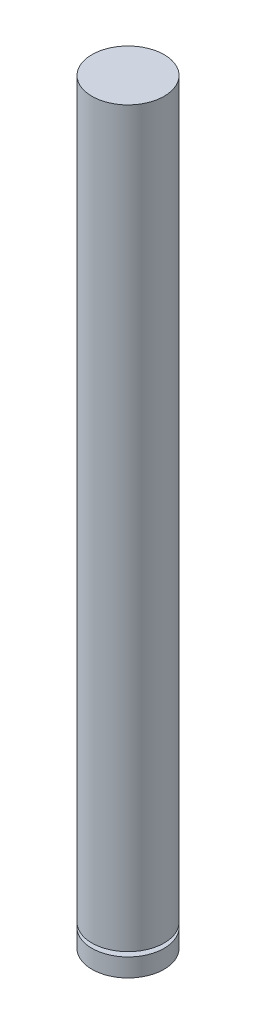
ISO-10303-21;
HEADER;
FILE_DESCRIPTION(('STEP AP214'),'2;1');
FILE_NAME('part.step','',(''),(''),'','','');
FILE_SCHEMA(('AUTOMOTIVE_DESIGN { 1 0 10303 214 1 1 1 1 }'));
ENDSEC;
DATA;
#1=APPLICATION_CONTEXT('core data for automotive mechanical design processes');
#2=APPLICATION_PROTOCOL_DEFINITION('international standard','automotive_design',2000,#1);
#3=PRODUCT_CONTEXT('',#1,'mechanical');
#4=PRODUCT('Part','Part','',(#3));
#5=PRODUCT_RELATED_PRODUCT_CATEGORY('part','',(#4));
#6=PRODUCT_DEFINITION_FORMATION('','',#4);
#7=PRODUCT_DEFINITION_CONTEXT('part definition',#1,'design');
#8=PRODUCT_DEFINITION('design','',#6,#7);
#9=PRODUCT_DEFINITION_SHAPE('','',#8);
#10=(LENGTH_UNIT() NAMED_UNIT(*) SI_UNIT(.MILLI.,.METRE.));
#11=(NAMED_UNIT(*) PLANE_ANGLE_UNIT() SI_UNIT($,.RADIAN.));
#12=(NAMED_UNIT(*) SI_UNIT($,.STERADIAN.) SOLID_ANGLE_UNIT());
#13=UNCERTAINTY_MEASURE_WITH_UNIT(LENGTH_MEASURE(1.E-05),#10,'distance_accuracy_value','');
#14=(GEOMETRIC_REPRESENTATION_CONTEXT(3) GLOBAL_UNCERTAINTY_ASSIGNED_CONTEXT((#13)) GLOBAL_UNIT_ASSIGNED_CONTEXT((#10,
#11,#12)) REPRESENTATION_CONTEXT('',''));
#15=CARTESIAN_POINT('',(0.,0.,0.));
#16=DIRECTION('',(0.,0.,1.));
#17=DIRECTION('',(1.,0.,0.));
#18=AXIS2_PLACEMENT_3D('',#15,#16,#17);
#19=CARTESIAN_POINT('',(0.,33.2,0.));
#20=DIRECTION('',(0.,-1.,0.));
#21=DIRECTION('',(0.,0.,-1.));
#22=AXIS2_PLACEMENT_3D('',#19,#20,#21);
#23=CYLINDRICAL_SURFACE('',#22,1.585);
#24=CARTESIAN_POINT('',(0.,0.,0.));
#25=DIRECTION('',(0.,1.,0.));
#26=DIRECTION('',(0.,0.,1.));
#27=AXIS2_PLACEMENT_3D('',#24,#25,#26);
#28=CIRCLE('',#27,1.585);
#29=CARTESIAN_POINT('',(0.,0.,-1.585));
#30=VERTEX_POINT('',#29);
#31=EDGE_CURVE('E36',#30,#30,#28,.T.);
#32=CARTESIAN_POINT('',(0.,0.800000000000002,0.));
#33=DIRECTION('',(0.,-1.,0.));
#34=DIRECTION('',(0.,0.,-1.));
#35=AXIS2_PLACEMENT_3D('',#32,#33,#34);
#36=CIRCLE('',#35,1.585);
#37=CARTESIAN_POINT('',(0.,0.800000000000009,-1.585));
#38=VERTEX_POINT('',#37);
#39=EDGE_CURVE('E47',#38,#38,#36,.T.);
#40=CARTESIAN_POINT('',(0.,0.,-1.585));
#41=CARTESIAN_POINT('',(0.,0.0083333333333324,-1.585));
#42=CARTESIAN_POINT('',(0.,0.0166666666666648,-1.585));
#43=CARTESIAN_POINT('',(0.,0.033333333333332,-1.585));
#44=CARTESIAN_POINT('',(0.,0.0416666666666667,-1.585));
#45=CARTESIAN_POINT('',(0.,0.0583333333333338,-1.585));
#46=CARTESIAN_POINT('',(0.,0.0666666666666663,-1.585));
#47=CARTESIAN_POINT('',(0.,0.0833333333333334,-1.585));
#48=CARTESIAN_POINT('',(0.,0.0916666666666681,-1.585));
#49=CARTESIAN_POINT('',(0.,0.108333333333335,-1.585));
#50=CARTESIAN_POINT('',(0.,0.116666666666668,-1.585));
#51=CARTESIAN_POINT('',(0.,0.133333333333335,-1.585));
#52=CARTESIAN_POINT('',(0.,0.14166666666667,-1.585));
#53=CARTESIAN_POINT('',(0.,0.158333333333337,-1.585));
#54=CARTESIAN_POINT('',(0.,0.166666666666669,-1.585));
#55=CARTESIAN_POINT('',(0.,0.183333333333336,-1.585));
#56=CARTESIAN_POINT('',(0.,0.191666666666671,-1.585));
#57=CARTESIAN_POINT('',(0.,0.208333333333338,-1.585));
#58=CARTESIAN_POINT('',(0.,0.216666666666671,-1.585));
#59=CARTESIAN_POINT('',(0.,0.233333333333335,-1.585));
#60=CARTESIAN_POINT('',(0.,0.241666666666668,-1.585));
#61=CARTESIAN_POINT('',(0.,0.258333333333335,-1.585));
#62=CARTESIAN_POINT('',(0.,0.26666666666667,-1.585));
#63=CARTESIAN_POINT('',(0.,0.283333333333337,-1.585));
#64=CARTESIAN_POINT('',(0.,0.291666666666669,-1.585));
#65=CARTESIAN_POINT('',(0.,0.308333333333336,-1.585));
#66=CARTESIAN_POINT('',(0.,0.316666666666671,-1.585));
#67=CARTESIAN_POINT('',(0.,0.333333333333338,-1.585));
#68=CARTESIAN_POINT('',(0.,0.341666666666671,-1.585));
#69=CARTESIAN_POINT('',(0.,0.358333333333338,-1.585));
#70=CARTESIAN_POINT('',(0.,0.366666666666673,-1.585));
#71=CARTESIAN_POINT('',(0.,0.38333333333334,-1.585));
#72=CARTESIAN_POINT('',(0.,0.391666666666672,-1.585));
#73=CARTESIAN_POINT('',(0.,0.408333333333337,-1.585));
#74=CARTESIAN_POINT('',(0.,0.416666666666669,-1.585));
#75=CARTESIAN_POINT('',(0.,0.433333333333337,-1.585));
#76=CARTESIAN_POINT('',(0.,0.441666666666671,-1.585));
#77=CARTESIAN_POINT('',(0.,0.458333333333338,-1.585));
#78=CARTESIAN_POINT('',(0.,0.466666666666671,-1.585));
#79=CARTESIAN_POINT('',(0.,0.483333333333338,-1.585));
#80=CARTESIAN_POINT('',(0.,0.491666666666673,-1.585));
#81=CARTESIAN_POINT('',(0.,0.50833333333334,-1.585));
#82=CARTESIAN_POINT('',(0.,0.516666666666672,-1.585));
#83=CARTESIAN_POINT('',(0.,0.533333333333339,-1.585));
#84=CARTESIAN_POINT('',(0.,0.541666666666674,-1.585));
#85=CARTESIAN_POINT('',(0.,0.558333333333341,-1.585));
#86=CARTESIAN_POINT('',(0.,0.566666666666674,-1.585));
#87=CARTESIAN_POINT('',(0.,0.583333333333338,-1.585));
#88=CARTESIAN_POINT('',(0.,0.591666666666671,-1.585));
#89=CARTESIAN_POINT('',(0.,0.608333333333338,-1.585));
#90=CARTESIAN_POINT('',(0.,0.616666666666673,-1.585));
#91=CARTESIAN_POINT('',(0.,0.63333333333334,-1.585));
#92=CARTESIAN_POINT('',(0.,0.641666666666672,-1.585));
#93=CARTESIAN_POINT('',(0.,0.658333333333339,-1.585));
#94=CARTESIAN_POINT('',(0.,0.666666666666674,-1.585));
#95=CARTESIAN_POINT('',(0.,0.683333333333341,-1.585));
#96=CARTESIAN_POINT('',(0.,0.691666666666674,-1.585));
#97=CARTESIAN_POINT('',(0.,0.708333333333341,-1.585));
#98=CARTESIAN_POINT('',(0.,0.716666666666676,-1.585));
#99=CARTESIAN_POINT('',(0.,0.733333333333343,-1.585));
#100=CARTESIAN_POINT('',(0.,0.741666666666675,-1.585));
#101=CARTESIAN_POINT('',(0.,0.758333333333342,-1.585));
#102=CARTESIAN_POINT('',(0.,0.766666666666677,-1.585));
#103=CARTESIAN_POINT('',(0.,0.783333333333344,-1.585));
#104=CARTESIAN_POINT('',(0.,0.791666666666677,-1.585));
#105=CARTESIAN_POINT('',(0.,0.800000000000009,-1.585));
#106=B_SPLINE_CURVE_WITH_KNOTS('',3,(#40,#41,#42,#43,#44,#45,#46,#47,#48,#49,#50,#51,#52,#53,
#54,#55,#56,#57,#58,#59,#60,#61,#62,#63,#64,#65,#66,#67,#68,#69,#70,#71,#72,#73,#74,#75,#76,#77,
#78,#79,#80,#81,#82,#83,#84,#85,#86,#87,#88,#89,#90,#91,#92,#93,#94,#95,#96,#97,#98,#99,#100,
#101,#102,#103,#104,#105),.UNSPECIFIED.,.F.,.F.,(4,2,2,2,2,2,2,2,2,2,2,2,2,2,2,2,2,2,2,2,2,2,2,
2,2,2,2,2,2,2,2,2,4),(0.,0.0249999999999972,0.0500000000000014,0.0749999999999987,
0.100000000000003,0.125,0.150000000000004,0.175000000000002,0.200000000000006,0.225000000000003,
0.25,0.275000000000004,0.300000000000002,0.325000000000006,0.350000000000003,0.375000000000007,
0.400000000000005,0.425000000000002,0.450000000000006,0.475000000000003,0.500000000000007,
0.525000000000005,0.550000000000009,0.575000000000006,0.600000000000003,0.625000000000008,
0.650000000000005,0.675000000000009,0.700000000000006,0.72500000000001,0.750000000000008,
0.775000000000012,0.800000000000009),.UNSPECIFIED.);
#107=EDGE_CURVE('BSEAM32',#30,#38,#106,.T.);
#108=ORIENTED_EDGE('',*,*,#31,.T.);
#109=ORIENTED_EDGE('',*,*,#39,.T.);
#110=ORIENTED_EDGE('',*,*,#107,.T.);
#111=ORIENTED_EDGE('',*,*,#107,.F.);
#112=EDGE_LOOP('',(#108,#110,#109,#111));
#113=FACE_BOUND('',#112,.T.);
#114=ADVANCED_FACE('F32',(#113),#23,.T.);
#115=CARTESIAN_POINT('',(0.,0.,0.));
#116=DIRECTION('',(0.,1.,0.));
#117=DIRECTION('',(0.,0.,1.));
#118=AXIS2_PLACEMENT_3D('',#115,#116,#117);
#119=PLANE('',#118);
#120=ORIENTED_EDGE('',*,*,#31,.F.);
#121=EDGE_LOOP('',(#120));
#122=FACE_BOUND('',#121,.T.);
#123=ADVANCED_FACE('F75',(#122),#119,.F.);
#124=CARTESIAN_POINT('',(0.,-1.7,0.));
#125=DIRECTION('',(0.,-1.,0.));
#126=DIRECTION('',(0.,0.,-1.));
#127=AXIS2_PLACEMENT_3D('',#124,#125,#126);
#128=CYLINDRICAL_SURFACE('',#127,1.085);
#129=CARTESIAN_POINT('',(0.,1.,0.));
#130=DIRECTION('',(0.,-1.,0.));
#131=DIRECTION('',(0.,0.,-1.));
#132=AXIS2_PLACEMENT_3D('',#129,#130,#131);
#133=CIRCLE('',#132,1.085);
#134=CARTESIAN_POINT('',(0.,1.,-1.085));
#135=VERTEX_POINT('',#134);
#136=EDGE_CURVE('E53',#135,#135,#133,.T.);
#137=ORIENTED_EDGE('',*,*,#136,.T.);
#138=EDGE_LOOP('',(#137));
#139=FACE_BOUND('',#138,.T.);
#140=CARTESIAN_POINT('',(0.,0.800000000000002,0.));
#141=DIRECTION('',(0.,-1.,0.));
#142=DIRECTION('',(0.,0.,-1.));
#143=AXIS2_PLACEMENT_3D('',#140,#141,#142);
#144=CIRCLE('',#143,1.085);
#145=CARTESIAN_POINT('',(0.,0.800000000000002,-1.085));
#146=VERTEX_POINT('',#145);
#147=EDGE_CURVE('E43',#146,#146,#144,.T.);
#148=ORIENTED_EDGE('',*,*,#147,.F.);
#149=EDGE_LOOP('',(#148));
#150=FACE_BOUND('',#149,.T.);
#151=ADVANCED_FACE('F57',(#139,#150),#128,.T.);
#152=CARTESIAN_POINT('',(0.,0.800000000000002,0.));
#153=DIRECTION('',(0.,1.,0.));
#154=DIRECTION('',(0.,0.,1.));
#155=AXIS2_PLACEMENT_3D('',#152,#153,#154);
#156=PLANE('',#155);
#157=ORIENTED_EDGE('',*,*,#147,.T.);
#158=EDGE_LOOP('',(#157));
#159=FACE_BOUND('',#158,.T.);
#160=ORIENTED_EDGE('',*,*,#39,.F.);
#161=EDGE_LOOP('',(#160));
#162=FACE_BOUND('',#161,.T.);
#163=ADVANCED_FACE('F64',(#159,#162),#156,.T.);
#164=CARTESIAN_POINT('',(0.,1.,0.));
#165=DIRECTION('',(0.,1.,0.));
#166=DIRECTION('',(0.,0.,1.));
#167=AXIS2_PLACEMENT_3D('',#164,#165,#166);
#168=PLANE('',#167);
#169=ORIENTED_EDGE('',*,*,#136,.F.);
#170=EDGE_LOOP('',(#169));
#171=FACE_BOUND('',#170,.T.);
#172=CARTESIAN_POINT('',(0.,1.,0.));
#173=DIRECTION('',(0.,-1.,0.));
#174=DIRECTION('',(0.,0.,-1.));
#175=AXIS2_PLACEMENT_3D('',#172,#173,#174);
#176=CIRCLE('',#175,1.585);
#177=CARTESIAN_POINT('',(0.,1.,-1.585));
#178=VERTEX_POINT('',#177);
#179=EDGE_CURVE('E50',#178,#178,#176,.T.);
#180=ORIENTED_EDGE('',*,*,#179,.T.);
#181=EDGE_LOOP('',(#180));
#182=FACE_BOUND('',#181,.T.);
#183=ADVANCED_FACE('F60',(#171,#182),#168,.F.);
#184=CARTESIAN_POINT('',(0.,33.2,0.));
#185=DIRECTION('',(0.,1.,0.));
#186=DIRECTION('',(0.,0.,1.));
#187=AXIS2_PLACEMENT_3D('',#184,#185,#186);
#188=PLANE('',#187);
#189=CARTESIAN_POINT('',(0.,33.2,0.));
#190=DIRECTION('',(0.,1.,0.));
#191=DIRECTION('',(0.,0.,1.));
#192=AXIS2_PLACEMENT_3D('',#189,#190,#191);
#193=CIRCLE('',#192,1.585);
#194=CARTESIAN_POINT('',(0.,33.2,-1.585));
#195=VERTEX_POINT('',#194);
#196=EDGE_CURVE('E10',#195,#195,#193,.T.);
#197=ORIENTED_EDGE('',*,*,#196,.T.);
#198=EDGE_LOOP('',(#197));
#199=FACE_BOUND('',#198,.T.);
#200=ADVANCED_FACE('F63',(#199),#188,.T.);
#201=CARTESIAN_POINT('',(0.,1.,-1.585));
#202=CARTESIAN_POINT('',(0.,1.33541666666667,-1.585));
#203=CARTESIAN_POINT('',(0.,1.67083333333333,-1.585));
#204=CARTESIAN_POINT('',(0.,2.34166666666666,-1.585));
#205=CARTESIAN_POINT('',(0.,2.67708333333333,-1.585));
#206=CARTESIAN_POINT('',(0.,3.34791666666666,-1.585));
#207=CARTESIAN_POINT('',(0.,3.68333333333333,-1.585));
#208=CARTESIAN_POINT('',(0.,4.35416666666667,-1.585));
#209=CARTESIAN_POINT('',(0.,4.68958333333333,-1.585));
#210=CARTESIAN_POINT('',(0.,5.36041666666666,-1.585));
#211=CARTESIAN_POINT('',(0.,5.69583333333333,-1.585));
#212=CARTESIAN_POINT('',(0.,6.36666666666667,-1.585));
#213=CARTESIAN_POINT('',(0.,6.70208333333333,-1.585));
#214=CARTESIAN_POINT('',(0.,7.37291666666667,-1.585));
#215=CARTESIAN_POINT('',(0.,7.70833333333333,-1.585));
#216=CARTESIAN_POINT('',(0.,8.37916666666666,-1.585));
#217=CARTESIAN_POINT('',(0.,8.71458333333333,-1.585));
#218=CARTESIAN_POINT('',(0.,9.38541666666666,-1.585));
#219=CARTESIAN_POINT('',(0.,9.72083333333333,-1.585));
#220=CARTESIAN_POINT('',(0.,10.3916666666667,-1.585));
#221=CARTESIAN_POINT('',(0.,10.7270833333333,-1.585));
#222=CARTESIAN_POINT('',(0.,11.3979166666667,-1.585));
#223=CARTESIAN_POINT('',(0.,11.7333333333333,-1.585));
#224=CARTESIAN_POINT('',(0.,12.4041666666667,-1.585));
#225=CARTESIAN_POINT('',(0.,12.7395833333333,-1.585));
#226=CARTESIAN_POINT('',(0.,13.4104166666667,-1.585));
#227=CARTESIAN_POINT('',(0.,13.7458333333333,-1.585));
#228=CARTESIAN_POINT('',(0.,14.4166666666667,-1.585));
#229=CARTESIAN_POINT('',(0.,14.7520833333333,-1.585));
#230=CARTESIAN_POINT('',(0.,15.4229166666667,-1.585));
#231=CARTESIAN_POINT('',(0.,15.7583333333333,-1.585));
#232=CARTESIAN_POINT('',(0.,16.4291666666667,-1.585));
#233=CARTESIAN_POINT('',(0.,16.7645833333333,-1.585));
#234=CARTESIAN_POINT('',(0.,17.4354166666667,-1.585));
#235=CARTESIAN_POINT('',(0.,17.7708333333333,-1.585));
#236=CARTESIAN_POINT('',(0.,18.4416666666667,-1.585));
#237=CARTESIAN_POINT('',(0.,18.7770833333333,-1.585));
#238=CARTESIAN_POINT('',(0.,19.4479166666667,-1.585));
#239=CARTESIAN_POINT('',(0.,19.7833333333333,-1.585));
#240=CARTESIAN_POINT('',(0.,20.4541666666667,-1.585));
#241=CARTESIAN_POINT('',(0.,20.7895833333333,-1.585));
#242=CARTESIAN_POINT('',(0.,21.4604166666667,-1.585));
#243=CARTESIAN_POINT('',(0.,21.7958333333333,-1.585));
#244=CARTESIAN_POINT('',(0.,22.4666666666667,-1.585));
#245=CARTESIAN_POINT('',(0.,22.8020833333333,-1.585));
#246=CARTESIAN_POINT('',(0.,23.4729166666667,-1.585));
#247=CARTESIAN_POINT('',(0.,23.8083333333333,-1.585));
#248=CARTESIAN_POINT('',(0.,24.4791666666667,-1.585));
#249=CARTESIAN_POINT('',(0.,24.8145833333333,-1.585));
#250=CARTESIAN_POINT('',(0.,25.4854166666667,-1.585));
#251=CARTESIAN_POINT('',(0.,25.8208333333333,-1.585));
#252=CARTESIAN_POINT('',(0.,26.4916666666667,-1.585));
#253=CARTESIAN_POINT('',(0.,26.8270833333333,-1.585));
#254=CARTESIAN_POINT('',(0.,27.4979166666667,-1.585));
#255=CARTESIAN_POINT('',(0.,27.8333333333333,-1.585));
#256=CARTESIAN_POINT('',(0.,28.5041666666667,-1.585));
#257=CARTESIAN_POINT('',(0.,28.8395833333333,-1.585));
#258=CARTESIAN_POINT('',(0.,29.5104166666667,-1.585));
#259=CARTESIAN_POINT('',(0.,29.8458333333333,-1.585));
#260=CARTESIAN_POINT('',(0.,30.5166666666667,-1.585));
#261=CARTESIAN_POINT('',(0.,30.8520833333333,-1.585));
#262=CARTESIAN_POINT('',(0.,31.5229166666667,-1.585));
#263=CARTESIAN_POINT('',(0.,31.8583333333333,-1.585));
#264=CARTESIAN_POINT('',(0.,32.5291666666667,-1.585));
#265=CARTESIAN_POINT('',(0.,32.8645833333333,-1.585));
#266=CARTESIAN_POINT('',(0.,33.2,-1.585));
#267=B_SPLINE_CURVE_WITH_KNOTS('',3,(#201,#202,#203,#204,#205,#206,#207,#208,#209,#210,#211,
#212,#213,#214,#215,#216,#217,#218,#219,#220,#221,#222,#223,#224,#225,#226,#227,#228,#229,#230,
#231,#232,#233,#234,#235,#236,#237,#238,#239,#240,#241,#242,#243,#244,#245,#246,#247,#248,#249,
#250,#251,#252,#253,#254,#255,#256,#257,#258,#259,#260,#261,#262,#263,#264,#265,#266),
.UNSPECIFIED.,.F.,.F.,(4,2,2,2,2,2,2,2,2,2,2,2,2,2,2,2,2,2,2,2,2,2,2,2,2,2,2,2,2,2,2,2,4),(0.,
1.00625,2.0125,3.01875,4.025,5.03125,6.0375,7.04375,8.05,9.05625,10.0625,11.06875,12.075,
13.08125,14.0875,15.09375,16.1,17.10625,18.1125,19.11875,20.125,21.13125,22.1375,23.14375,24.15,
25.15625,26.1625,27.16875,28.175,29.18125,30.1875,31.19375,32.2),.UNSPECIFIED.);
#268=EDGE_CURVE('BSEAM34',#178,#195,#267,.T.);
#269=ORIENTED_EDGE('',*,*,#179,.F.);
#270=ORIENTED_EDGE('',*,*,#196,.F.);
#271=ORIENTED_EDGE('',*,*,#268,.T.);
#272=ORIENTED_EDGE('',*,*,#268,.F.);
#273=EDGE_LOOP('',(#269,#271,#270,#272));
#274=FACE_BOUND('',#273,.T.);
#275=ADVANCED_FACE('F34',(#274),#23,.T.);
#276=CLOSED_SHELL('',(#114,#123,#151,#163,#183,#200,#275));
#277=MANIFOLD_SOLID_BREP('B2',#276);
#278=ADVANCED_BREP_SHAPE_REPRESENTATION('',(#18,#277),#14);
#279=SHAPE_DEFINITION_REPRESENTATION(#9,#278);
ENDSEC;
END-ISO-10303-21;
